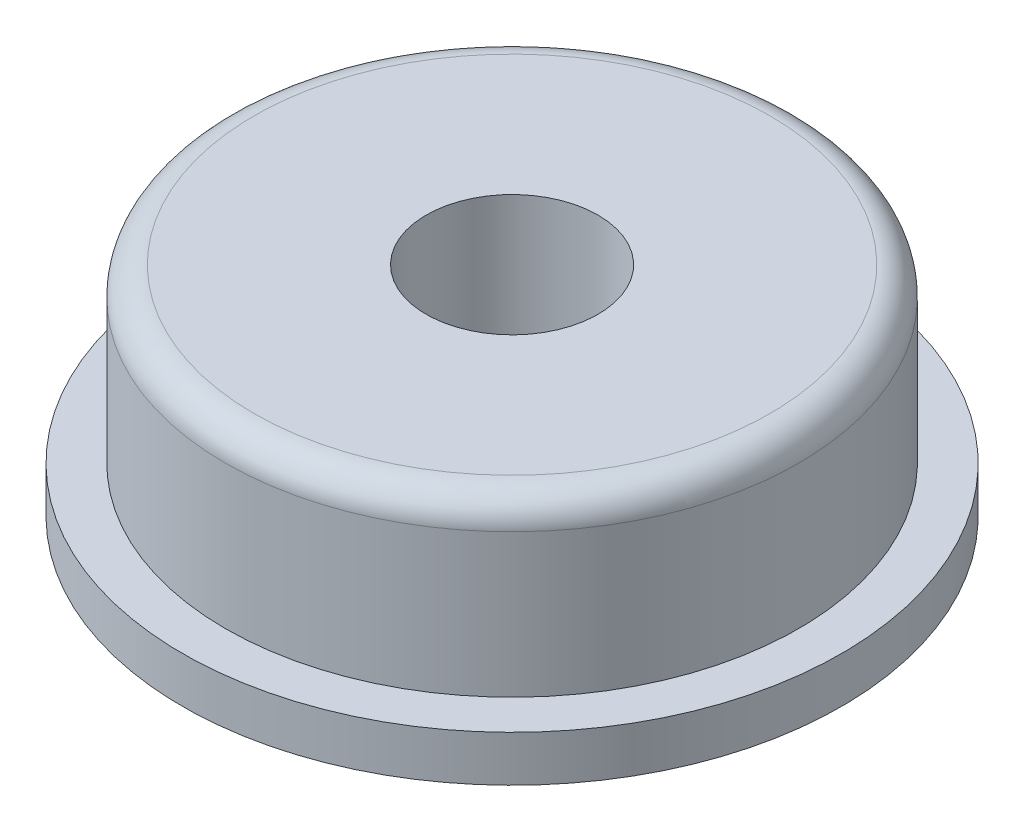
ISO-10303-21;
HEADER;
FILE_DESCRIPTION(('STEP AP214'),'2;1');
FILE_NAME('part.step','',(''),(''),'','','');
FILE_SCHEMA(('AUTOMOTIVE_DESIGN { 1 0 10303 214 1 1 1 1 }'));
ENDSEC;
DATA;
#1=APPLICATION_CONTEXT('core data for automotive mechanical design processes');
#2=APPLICATION_PROTOCOL_DEFINITION('international standard','automotive_design',2000,#1);
#3=PRODUCT_CONTEXT('',#1,'mechanical');
#4=PRODUCT('Part','Part','',(#3));
#5=PRODUCT_RELATED_PRODUCT_CATEGORY('part','',(#4));
#6=PRODUCT_DEFINITION_FORMATION('','',#4);
#7=PRODUCT_DEFINITION_CONTEXT('part definition',#1,'design');
#8=PRODUCT_DEFINITION('design','',#6,#7);
#9=PRODUCT_DEFINITION_SHAPE('','',#8);
#10=(LENGTH_UNIT() NAMED_UNIT(*) SI_UNIT(.MILLI.,.METRE.));
#11=(NAMED_UNIT(*) PLANE_ANGLE_UNIT() SI_UNIT($,.RADIAN.));
#12=(NAMED_UNIT(*) SI_UNIT($,.STERADIAN.) SOLID_ANGLE_UNIT());
#13=UNCERTAINTY_MEASURE_WITH_UNIT(LENGTH_MEASURE(1.E-05),#10,'distance_accuracy_value','');
#14=(GEOMETRIC_REPRESENTATION_CONTEXT(3) GLOBAL_UNCERTAINTY_ASSIGNED_CONTEXT((#13)) GLOBAL_UNIT_ASSIGNED_CONTEXT((#10,
#11,#12)) REPRESENTATION_CONTEXT('',''));
#15=CARTESIAN_POINT('',(0.,0.,0.));
#16=DIRECTION('',(0.,0.,1.));
#17=DIRECTION('',(1.,0.,0.));
#18=AXIS2_PLACEMENT_3D('',#15,#16,#17);
#19=CARTESIAN_POINT('',(0.,3.8,0.));
#20=DIRECTION('',(0.,1.,0.));
#21=DIRECTION('',(0.,0.,1.));
#22=AXIS2_PLACEMENT_3D('',#19,#20,#21);
#23=PLANE('',#22);
#24=CARTESIAN_POINT('',(0.,3.8,0.));
#25=DIRECTION('',(0.,1.,0.));
#26=DIRECTION('',(0.,0.,1.));
#27=AXIS2_PLACEMENT_3D('',#24,#25,#26);
#28=CIRCLE('',#27,4.5);
#29=CARTESIAN_POINT('',(0.,3.8,4.5));
#30=VERTEX_POINT('',#29);
#31=EDGE_CURVE('E39',#30,#30,#28,.T.);
#32=ORIENTED_EDGE('',*,*,#31,.T.);
#33=EDGE_LOOP('',(#32));
#34=FACE_BOUND('',#33,.T.);
#35=CARTESIAN_POINT('',(0.,3.8,0.));
#36=DIRECTION('',(0.,1.,0.));
#37=DIRECTION('',(0.,0.,1.));
#38=AXIS2_PLACEMENT_3D('',#35,#36,#37);
#39=CIRCLE('',#38,1.5);
#40=CARTESIAN_POINT('',(0.,3.8,-1.5));
#41=VERTEX_POINT('',#40);
#42=EDGE_CURVE('E47',#41,#41,#39,.T.);
#43=ORIENTED_EDGE('',*,*,#42,.F.);
#44=EDGE_LOOP('',(#43));
#45=FACE_BOUND('',#44,.T.);
#46=ADVANCED_FACE('F32',(#34,#45),#23,.T.);
#47=CARTESIAN_POINT('',(0.,3.8,0.));
#48=DIRECTION('',(0.,-1.,0.));
#49=DIRECTION('',(0.,0.,-1.));
#50=AXIS2_PLACEMENT_3D('',#47,#48,#49);
#51=CYLINDRICAL_SURFACE('',#50,5.75);
#52=CARTESIAN_POINT('',(0.,0.,0.));
#53=DIRECTION('',(0.,1.,0.));
#54=DIRECTION('',(0.,0.,1.));
#55=AXIS2_PLACEMENT_3D('',#52,#53,#54);
#56=CIRCLE('',#55,5.75);
#57=CARTESIAN_POINT('',(0.,0.,-5.75));
#58=VERTEX_POINT('',#57);
#59=EDGE_CURVE('E43',#58,#58,#56,.T.);
#60=CARTESIAN_POINT('',(0.,0.8,0.));
#61=DIRECTION('',(0.,1.,0.));
#62=DIRECTION('',(0.,0.,1.));
#63=AXIS2_PLACEMENT_3D('',#60,#61,#62);
#64=CIRCLE('',#63,5.75);
#65=CARTESIAN_POINT('',(0.,0.799999999999999,-5.75));
#66=VERTEX_POINT('',#65);
#67=EDGE_CURVE('E50',#66,#66,#64,.T.);
#68=CARTESIAN_POINT('',(0.,0.,-5.75));
#69=CARTESIAN_POINT('',(0.,0.00833333333333328,-5.75));
#70=CARTESIAN_POINT('',(0.,0.0166666666666666,-5.75));
#71=CARTESIAN_POINT('',(0.,0.0333333333333333,-5.75));
#72=CARTESIAN_POINT('',(0.,0.0416666666666667,-5.75));
#73=CARTESIAN_POINT('',(0.,0.0583333333333334,-5.75));
#74=CARTESIAN_POINT('',(0.,0.0666666666666667,-5.75));
#75=CARTESIAN_POINT('',(0.,0.0833333333333333,-5.75));
#76=CARTESIAN_POINT('',(0.,0.0916666666666665,-5.75));
#77=CARTESIAN_POINT('',(0.,0.108333333333333,-5.75));
#78=CARTESIAN_POINT('',(0.,0.116666666666667,-5.75));
#79=CARTESIAN_POINT('',(0.,0.133333333333333,-5.75));
#80=CARTESIAN_POINT('',(0.,0.141666666666667,-5.75));
#81=CARTESIAN_POINT('',(0.,0.158333333333333,-5.75));
#82=CARTESIAN_POINT('',(0.,0.166666666666667,-5.75));
#83=CARTESIAN_POINT('',(0.,0.183333333333333,-5.75));
#84=CARTESIAN_POINT('',(0.,0.191666666666666,-5.75));
#85=CARTESIAN_POINT('',(0.,0.208333333333333,-5.75));
#86=CARTESIAN_POINT('',(0.,0.216666666666667,-5.75));
#87=CARTESIAN_POINT('',(0.,0.233333333333333,-5.75));
#88=CARTESIAN_POINT('',(0.,0.241666666666667,-5.75));
#89=CARTESIAN_POINT('',(0.,0.258333333333333,-5.75));
#90=CARTESIAN_POINT('',(0.,0.266666666666667,-5.75));
#91=CARTESIAN_POINT('',(0.,0.283333333333333,-5.75));
#92=CARTESIAN_POINT('',(0.,0.291666666666667,-5.75));
#93=CARTESIAN_POINT('',(0.,0.308333333333333,-5.75));
#94=CARTESIAN_POINT('',(0.,0.316666666666666,-5.75));
#95=CARTESIAN_POINT('',(0.,0.333333333333333,-5.75));
#96=CARTESIAN_POINT('',(0.,0.341666666666666,-5.75));
#97=CARTESIAN_POINT('',(0.,0.358333333333333,-5.75));
#98=CARTESIAN_POINT('',(0.,0.366666666666666,-5.75));
#99=CARTESIAN_POINT('',(0.,0.383333333333333,-5.75));
#100=CARTESIAN_POINT('',(0.,0.391666666666666,-5.75));
#101=CARTESIAN_POINT('',(0.,0.408333333333333,-5.75));
#102=CARTESIAN_POINT('',(0.,0.416666666666666,-5.75));
#103=CARTESIAN_POINT('',(0.,0.433333333333333,-5.75));
#104=CARTESIAN_POINT('',(0.,0.441666666666666,-5.75));
#105=CARTESIAN_POINT('',(0.,0.458333333333333,-5.75));
#106=CARTESIAN_POINT('',(0.,0.466666666666666,-5.75));
#107=CARTESIAN_POINT('',(0.,0.483333333333333,-5.75));
#108=CARTESIAN_POINT('',(0.,0.491666666666666,-5.75));
#109=CARTESIAN_POINT('',(0.,0.508333333333333,-5.75));
#110=CARTESIAN_POINT('',(0.,0.516666666666666,-5.75));
#111=CARTESIAN_POINT('',(0.,0.533333333333333,-5.75));
#112=CARTESIAN_POINT('',(0.,0.541666666666666,-5.75));
#113=CARTESIAN_POINT('',(0.,0.558333333333333,-5.75));
#114=CARTESIAN_POINT('',(0.,0.566666666666666,-5.75));
#115=CARTESIAN_POINT('',(0.,0.583333333333333,-5.75));
#116=CARTESIAN_POINT('',(0.,0.591666666666666,-5.75));
#117=CARTESIAN_POINT('',(0.,0.608333333333333,-5.75));
#118=CARTESIAN_POINT('',(0.,0.616666666666666,-5.75));
#119=CARTESIAN_POINT('',(0.,0.633333333333333,-5.75));
#120=CARTESIAN_POINT('',(0.,0.641666666666666,-5.75));
#121=CARTESIAN_POINT('',(0.,0.658333333333333,-5.75));
#122=CARTESIAN_POINT('',(0.,0.666666666666666,-5.75));
#123=CARTESIAN_POINT('',(0.,0.683333333333333,-5.75));
#124=CARTESIAN_POINT('',(0.,0.691666666666666,-5.75));
#125=CARTESIAN_POINT('',(0.,0.708333333333333,-5.75));
#126=CARTESIAN_POINT('',(0.,0.716666666666666,-5.75));
#127=CARTESIAN_POINT('',(0.,0.733333333333333,-5.75));
#128=CARTESIAN_POINT('',(0.,0.741666666666666,-5.75));
#129=CARTESIAN_POINT('',(0.,0.758333333333333,-5.75));
#130=CARTESIAN_POINT('',(0.,0.766666666666666,-5.75));
#131=CARTESIAN_POINT('',(0.,0.783333333333333,-5.75));
#132=CARTESIAN_POINT('',(0.,0.791666666666666,-5.75));
#133=CARTESIAN_POINT('',(0.,0.799999999999999,-5.75));
#134=B_SPLINE_CURVE_WITH_KNOTS('',3,(#68,#69,#70,#71,#72,#73,#74,#75,#76,#77,#78,#79,#80,#81,
#82,#83,#84,#85,#86,#87,#88,#89,#90,#91,#92,#93,#94,#95,#96,#97,#98,#99,#100,#101,#102,#103,
#104,#105,#106,#107,#108,#109,#110,#111,#112,#113,#114,#115,#116,#117,#118,#119,#120,#121,#122,
#123,#124,#125,#126,#127,#128,#129,#130,#131,#132,#133),.UNSPECIFIED.,.F.,.F.,(4,2,2,2,2,2,2,2,
2,2,2,2,2,2,2,2,2,2,2,2,2,2,2,2,2,2,2,2,2,2,2,2,4),(0.,0.0249999999999998,0.0500000000000001,
0.075,0.0999999999999998,0.125,0.15,0.175,0.2,0.225,0.25,0.275,0.3,0.325,0.35,0.375,0.4,0.425,
0.45,0.475,0.5,0.524999999999999,0.55,0.575,0.6,0.625,0.65,0.674999999999999,0.7,0.725,0.75,
0.775,0.799999999999999),.UNSPECIFIED.);
#135=EDGE_CURVE('BSEAM71',#58,#66,#134,.T.);
#136=ORIENTED_EDGE('',*,*,#59,.T.);
#137=ORIENTED_EDGE('',*,*,#67,.F.);
#138=ORIENTED_EDGE('',*,*,#135,.T.);
#139=ORIENTED_EDGE('',*,*,#135,.F.);
#140=EDGE_LOOP('',(#136,#138,#137,#139));
#141=FACE_BOUND('',#140,.T.);
#142=ADVANCED_FACE('F71',(#141),#51,.T.);
#143=CARTESIAN_POINT('',(0.,0.,0.));
#144=DIRECTION('',(0.,1.,0.));
#145=DIRECTION('',(0.,0.,1.));
#146=AXIS2_PLACEMENT_3D('',#143,#144,#145);
#147=PLANE('',#146);
#148=ORIENTED_EDGE('',*,*,#59,.F.);
#149=EDGE_LOOP('',(#148));
#150=FACE_BOUND('',#149,.T.);
#151=CARTESIAN_POINT('',(0.,0.,0.));
#152=DIRECTION('',(0.,1.,0.));
#153=DIRECTION('',(0.,0.,1.));
#154=AXIS2_PLACEMENT_3D('',#151,#152,#153);
#155=CIRCLE('',#154,1.5);
#156=CARTESIAN_POINT('',(0.,0.,-1.5));
#157=VERTEX_POINT('',#156);
#158=EDGE_CURVE('E52',#157,#157,#155,.T.);
#159=ORIENTED_EDGE('',*,*,#158,.T.);
#160=EDGE_LOOP('',(#159));
#161=FACE_BOUND('',#160,.T.);
#162=ADVANCED_FACE('F73',(#150,#161),#147,.F.);
#163=CARTESIAN_POINT('',(0.,3.8,0.));
#164=DIRECTION('',(0.,-1.,0.));
#165=DIRECTION('',(0.,0.,-1.));
#166=AXIS2_PLACEMENT_3D('',#163,#164,#165);
#167=CYLINDRICAL_SURFACE('',#166,1.5);
#168=CARTESIAN_POINT('',(0.,3.8,-1.5));
#169=CARTESIAN_POINT('',(0.,3.76041666666667,-1.5));
#170=CARTESIAN_POINT('',(0.,3.72083333333333,-1.5));
#171=CARTESIAN_POINT('',(0.,3.64166666666667,-1.5));
#172=CARTESIAN_POINT('',(0.,3.60208333333333,-1.5));
#173=CARTESIAN_POINT('',(0.,3.52291666666667,-1.5));
#174=CARTESIAN_POINT('',(0.,3.48333333333333,-1.5));
#175=CARTESIAN_POINT('',(0.,3.40416666666667,-1.5));
#176=CARTESIAN_POINT('',(0.,3.36458333333333,-1.5));
#177=CARTESIAN_POINT('',(0.,3.28541666666667,-1.5));
#178=CARTESIAN_POINT('',(0.,3.24583333333333,-1.5));
#179=CARTESIAN_POINT('',(0.,3.16666666666667,-1.5));
#180=CARTESIAN_POINT('',(0.,3.12708333333333,-1.5));
#181=CARTESIAN_POINT('',(0.,3.04791666666667,-1.5));
#182=CARTESIAN_POINT('',(0.,3.00833333333333,-1.5));
#183=CARTESIAN_POINT('',(0.,2.92916666666667,-1.5));
#184=CARTESIAN_POINT('',(0.,2.88958333333333,-1.5));
#185=CARTESIAN_POINT('',(0.,2.81041666666667,-1.5));
#186=CARTESIAN_POINT('',(0.,2.77083333333333,-1.5));
#187=CARTESIAN_POINT('',(0.,2.69166666666667,-1.5));
#188=CARTESIAN_POINT('',(0.,2.65208333333333,-1.5));
#189=CARTESIAN_POINT('',(0.,2.57291666666667,-1.5));
#190=CARTESIAN_POINT('',(0.,2.53333333333333,-1.5));
#191=CARTESIAN_POINT('',(0.,2.45416666666667,-1.5));
#192=CARTESIAN_POINT('',(0.,2.41458333333333,-1.5));
#193=CARTESIAN_POINT('',(0.,2.33541666666667,-1.5));
#194=CARTESIAN_POINT('',(0.,2.29583333333333,-1.5));
#195=CARTESIAN_POINT('',(0.,2.21666666666667,-1.5));
#196=CARTESIAN_POINT('',(0.,2.17708333333333,-1.5));
#197=CARTESIAN_POINT('',(0.,2.09791666666667,-1.5));
#198=CARTESIAN_POINT('',(0.,2.05833333333333,-1.5));
#199=CARTESIAN_POINT('',(0.,1.97916666666667,-1.5));
#200=CARTESIAN_POINT('',(0.,1.93958333333333,-1.5));
#201=CARTESIAN_POINT('',(0.,1.86041666666667,-1.5));
#202=CARTESIAN_POINT('',(0.,1.82083333333333,-1.5));
#203=CARTESIAN_POINT('',(0.,1.74166666666667,-1.5));
#204=CARTESIAN_POINT('',(0.,1.70208333333333,-1.5));
#205=CARTESIAN_POINT('',(0.,1.62291666666667,-1.5));
#206=CARTESIAN_POINT('',(0.,1.58333333333333,-1.5));
#207=CARTESIAN_POINT('',(0.,1.50416666666667,-1.5));
#208=CARTESIAN_POINT('',(0.,1.46458333333333,-1.5));
#209=CARTESIAN_POINT('',(0.,1.38541666666667,-1.5));
#210=CARTESIAN_POINT('',(0.,1.34583333333333,-1.5));
#211=CARTESIAN_POINT('',(0.,1.26666666666667,-1.5));
#212=CARTESIAN_POINT('',(0.,1.22708333333333,-1.5));
#213=CARTESIAN_POINT('',(0.,1.14791666666667,-1.5));
#214=CARTESIAN_POINT('',(0.,1.10833333333333,-1.5));
#215=CARTESIAN_POINT('',(0.,1.02916666666667,-1.5));
#216=CARTESIAN_POINT('',(0.,0.989583333333333,-1.5));
#217=CARTESIAN_POINT('',(0.,0.910416666666667,-1.5));
#218=CARTESIAN_POINT('',(0.,0.870833333333333,-1.5));
#219=CARTESIAN_POINT('',(0.,0.791666666666667,-1.5));
#220=CARTESIAN_POINT('',(0.,0.752083333333333,-1.5));
#221=CARTESIAN_POINT('',(0.,0.672916666666667,-1.5));
#222=CARTESIAN_POINT('',(0.,0.633333333333333,-1.5));
#223=CARTESIAN_POINT('',(0.,0.554166666666667,-1.5));
#224=CARTESIAN_POINT('',(0.,0.514583333333334,-1.5));
#225=CARTESIAN_POINT('',(0.,0.435416666666667,-1.5));
#226=CARTESIAN_POINT('',(0.,0.395833333333333,-1.5));
#227=CARTESIAN_POINT('',(0.,0.316666666666666,-1.5));
#228=CARTESIAN_POINT('',(0.,0.277083333333333,-1.5));
#229=CARTESIAN_POINT('',(0.,0.197916666666667,-1.5));
#230=CARTESIAN_POINT('',(0.,0.158333333333333,-1.5));
#231=CARTESIAN_POINT('',(0.,0.0791666666666666,-1.5));
#232=CARTESIAN_POINT('',(0.,0.0395833333333333,-1.5));
#233=CARTESIAN_POINT('',(0.,0.,-1.5));
#234=B_SPLINE_CURVE_WITH_KNOTS('',3,(#168,#169,#170,#171,#172,#173,#174,#175,#176,#177,#178,
#179,#180,#181,#182,#183,#184,#185,#186,#187,#188,#189,#190,#191,#192,#193,#194,#195,#196,#197,
#198,#199,#200,#201,#202,#203,#204,#205,#206,#207,#208,#209,#210,#211,#212,#213,#214,#215,#216,
#217,#218,#219,#220,#221,#222,#223,#224,#225,#226,#227,#228,#229,#230,#231,#232,#233),
.UNSPECIFIED.,.F.,.F.,(4,2,2,2,2,2,2,2,2,2,2,2,2,2,2,2,2,2,2,2,2,2,2,2,2,2,2,2,2,2,2,2,4),(0.,
0.11875,0.2375,0.35625,0.475,0.59375,0.7125,0.831249999999999,0.95,1.06875,1.1875,1.30625,1.425,
1.54375,1.6625,1.78125,1.9,2.01875,2.1375,2.25625,2.375,2.49375,2.6125,2.73125,2.85,2.96875,
3.0875,3.20625,3.325,3.44375,3.5625,3.68125,3.8),.UNSPECIFIED.);
#235=EDGE_CURVE('BSEAM67',#41,#157,#234,.T.);
#236=ORIENTED_EDGE('',*,*,#42,.T.);
#237=ORIENTED_EDGE('',*,*,#158,.F.);
#238=ORIENTED_EDGE('',*,*,#235,.T.);
#239=ORIENTED_EDGE('',*,*,#235,.F.);
#240=EDGE_LOOP('',(#236,#238,#237,#239));
#241=FACE_BOUND('',#240,.T.);
#242=ADVANCED_FACE('F67',(#241),#167,.F.);
#243=CARTESIAN_POINT('',(0.,0.8,0.));
#244=DIRECTION('',(0.,1.,0.));
#245=DIRECTION('',(0.,0.,1.));
#246=AXIS2_PLACEMENT_3D('',#243,#244,#245);
#247=PLANE('',#246);
#248=CARTESIAN_POINT('',(0.,0.8,0.));
#249=DIRECTION('',(0.,1.,0.));
#250=DIRECTION('',(0.,0.,1.));
#251=AXIS2_PLACEMENT_3D('',#248,#249,#250);
#252=CIRCLE('',#251,5.);
#253=CARTESIAN_POINT('',(0.,0.8,5.));
#254=VERTEX_POINT('',#253);
#255=EDGE_CURVE('E53',#254,#254,#252,.T.);
#256=ORIENTED_EDGE('',*,*,#255,.F.);
#257=EDGE_LOOP('',(#256));
#258=FACE_BOUND('',#257,.T.);
#259=ORIENTED_EDGE('',*,*,#67,.T.);
#260=EDGE_LOOP('',(#259));
#261=FACE_BOUND('',#260,.T.);
#262=ADVANCED_FACE('F64',(#258,#261),#247,.T.);
#263=CARTESIAN_POINT('',(0.,0.8,0.));
#264=DIRECTION('',(0.,1.,0.));
#265=DIRECTION('',(0.,0.,1.));
#266=AXIS2_PLACEMENT_3D('',#263,#264,#265);
#267=CYLINDRICAL_SURFACE('',#266,5.);
#268=CARTESIAN_POINT('',(0.,3.3,0.));
#269=DIRECTION('',(0.,1.,0.));
#270=DIRECTION('',(0.,0.,1.));
#271=AXIS2_PLACEMENT_3D('',#268,#269,#270);
#272=CIRCLE('',#271,5.);
#273=CARTESIAN_POINT('',(0.,3.3,5.));
#274=VERTEX_POINT('',#273);
#275=EDGE_CURVE('E11',#274,#274,#272,.F.);
#276=ORIENTED_EDGE('',*,*,#275,.T.);
#277=EDGE_LOOP('',(#276));
#278=FACE_BOUND('',#277,.T.);
#279=ORIENTED_EDGE('',*,*,#255,.T.);
#280=EDGE_LOOP('',(#279));
#281=FACE_BOUND('',#280,.T.);
#282=ADVANCED_FACE('F62',(#278,#281),#267,.T.);
#283=CARTESIAN_POINT('',(0.,3.3,0.));
#284=DIRECTION('',(0.,1.,0.));
#285=DIRECTION('',(0.,0.,1.));
#286=AXIS2_PLACEMENT_3D('',#283,#284,#285);
#287=TOROIDAL_SURFACE('',#286,4.5,0.5);
#288=ORIENTED_EDGE('',*,*,#275,.F.);
#289=EDGE_LOOP('',(#288));
#290=FACE_BOUND('',#289,.T.);
#291=ORIENTED_EDGE('',*,*,#31,.F.);
#292=EDGE_LOOP('',(#291));
#293=FACE_BOUND('',#292,.T.);
#294=ADVANCED_FACE('F34',(#290,#293),#287,.T.);
#295=CLOSED_SHELL('',(#46,#142,#162,#242,#262,#282,#294));
#296=MANIFOLD_SOLID_BREP('B2',#295);
#297=ADVANCED_BREP_SHAPE_REPRESENTATION('',(#18,#296),#14);
#298=SHAPE_DEFINITION_REPRESENTATION(#9,#297);
ENDSEC;
END-ISO-10303-21;
